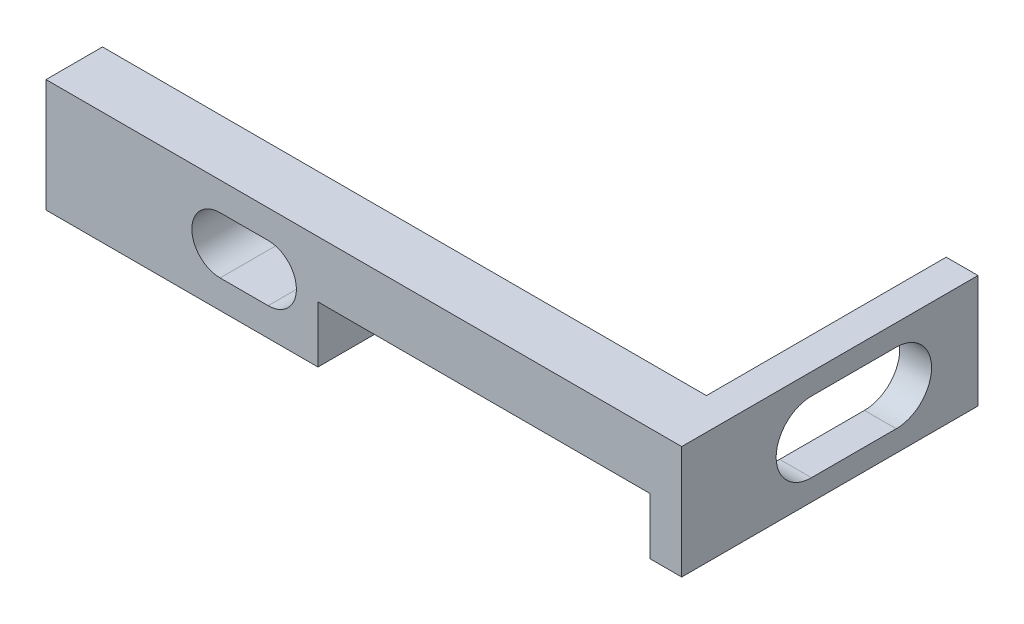
ISO-10303-21;
HEADER;
FILE_DESCRIPTION(('STEP AP214'),'2;1');
FILE_NAME('part.step','',(''),(''),'','','');
FILE_SCHEMA(('AUTOMOTIVE_DESIGN { 1 0 10303 214 1 1 1 1 }'));
ENDSEC;
DATA;
#1=APPLICATION_CONTEXT('core data for automotive mechanical design processes');
#2=APPLICATION_PROTOCOL_DEFINITION('international standard','automotive_design',2000,#1);
#3=PRODUCT_CONTEXT('',#1,'mechanical');
#4=PRODUCT('Part','Part','',(#3));
#5=PRODUCT_RELATED_PRODUCT_CATEGORY('part','',(#4));
#6=PRODUCT_DEFINITION_FORMATION('','',#4);
#7=PRODUCT_DEFINITION_CONTEXT('part definition',#1,'design');
#8=PRODUCT_DEFINITION('design','',#6,#7);
#9=PRODUCT_DEFINITION_SHAPE('','',#8);
#10=(LENGTH_UNIT() NAMED_UNIT(*) SI_UNIT(.MILLI.,.METRE.));
#11=(NAMED_UNIT(*) PLANE_ANGLE_UNIT() SI_UNIT($,.RADIAN.));
#12=(NAMED_UNIT(*) SI_UNIT($,.STERADIAN.) SOLID_ANGLE_UNIT());
#13=UNCERTAINTY_MEASURE_WITH_UNIT(LENGTH_MEASURE(1.E-05),#10,'distance_accuracy_value','');
#14=(GEOMETRIC_REPRESENTATION_CONTEXT(3) GLOBAL_UNCERTAINTY_ASSIGNED_CONTEXT((#13)) GLOBAL_UNIT_ASSIGNED_CONTEXT((#10,
#11,#12)) REPRESENTATION_CONTEXT('',''));
#15=CARTESIAN_POINT('',(0.,0.,0.));
#16=DIRECTION('',(0.,0.,1.));
#17=DIRECTION('',(1.,0.,0.));
#18=AXIS2_PLACEMENT_3D('',#15,#16,#17);
#19=CARTESIAN_POINT('',(45.,0.,0.));
#20=DIRECTION('',(0.,1.,0.));
#21=DIRECTION('',(0.,0.,1.));
#22=AXIS2_PLACEMENT_3D('',#19,#20,#21);
#23=PLANE('',#22);
#24=DIRECTION('',(0.,0.,-1.));
#25=VECTOR('',#24,1.);
#26=CARTESIAN_POINT('',(41.75,0.,12.5));
#27=LINE('',#26,#25);
#28=CARTESIAN_POINT('',(41.75,0.,12.5));
#29=VERTEX_POINT('',#28);
#30=CARTESIAN_POINT('',(41.75,0.,8.5));
#31=VERTEX_POINT('',#30);
#32=EDGE_CURVE('E201',#29,#31,#27,.T.);
#33=ORIENTED_EDGE('',*,*,#32,.T.);
#34=DIRECTION('',(-1.,0.,0.));
#35=VECTOR('',#34,1.);
#36=CARTESIAN_POINT('',(65.25,0.,8.5));
#37=LINE('',#36,#35);
#38=CARTESIAN_POINT('',(65.25,0.,8.5));
#39=VERTEX_POINT('',#38);
#40=EDGE_CURVE('E240',#39,#31,#37,.T.);
#41=ORIENTED_EDGE('',*,*,#40,.F.);
#42=DIRECTION('',(0.,0.,-1.));
#43=VECTOR('',#42,1.);
#44=CARTESIAN_POINT('',(65.25,0.,0.));
#45=LINE('',#44,#43);
#46=CARTESIAN_POINT('',(65.25,0.,12.5));
#47=VERTEX_POINT('',#46);
#48=EDGE_CURVE('E225',#47,#39,#45,.T.);
#49=ORIENTED_EDGE('',*,*,#48,.F.);
#50=DIRECTION('',(-1.,0.,0.));
#51=VECTOR('',#50,1.);
#52=CARTESIAN_POINT('',(67.5,0.,12.5));
#53=LINE('',#52,#51);
#54=EDGE_CURVE('E249',#47,#29,#53,.T.);
#55=ORIENTED_EDGE('',*,*,#54,.T.);
#56=EDGE_LOOP('',(#33,#41,#49,#55));
#57=FACE_BOUND('',#56,.T.);
#58=ADVANCED_FACE('F32',(#57),#23,.F.);
#59=CARTESIAN_POINT('',(22.5,4.,-12.5));
#60=DIRECTION('',(1.,0.,0.));
#61=DIRECTION('',(0.,0.,1.));
#62=AXIS2_PLACEMENT_3D('',#59,#60,#61);
#63=PLANE('',#62);
#64=DIRECTION('',(0.,0.,-1.));
#65=VECTOR('',#64,1.);
#66=CARTESIAN_POINT('',(22.5,-4.,-8.47465440443784));
#67=LINE('',#66,#65);
#68=CARTESIAN_POINT('',(22.5,-4.,12.5));
#69=VERTEX_POINT('',#68);
#70=CARTESIAN_POINT('',(22.5,-4.,8.49999999999999));
#71=VERTEX_POINT('',#70);
#72=EDGE_CURVE('E230',#69,#71,#67,.T.);
#73=ORIENTED_EDGE('',*,*,#72,.F.);
#74=DIRECTION('',(0.,-1.,0.));
#75=VECTOR('',#74,1.);
#76=CARTESIAN_POINT('',(22.5,4.,12.5));
#77=LINE('',#76,#75);
#78=CARTESIAN_POINT('',(22.5,4.,12.5));
#79=VERTEX_POINT('',#78);
#80=EDGE_CURVE('E258',#79,#69,#77,.T.);
#81=ORIENTED_EDGE('',*,*,#80,.F.);
#82=DIRECTION('',(0.,0.,-1.));
#83=VECTOR('',#82,1.);
#84=CARTESIAN_POINT('',(22.5,4.,-12.5));
#85=LINE('',#84,#83);
#86=CARTESIAN_POINT('',(22.5,4.,8.5));
#87=VERTEX_POINT('',#86);
#88=EDGE_CURVE('E250',#79,#87,#85,.T.);
#89=ORIENTED_EDGE('',*,*,#88,.T.);
#90=DIRECTION('',(0.,1.,0.));
#91=VECTOR('',#90,1.);
#92=CARTESIAN_POINT('',(22.5,-4.,8.5));
#93=LINE('',#92,#91);
#94=EDGE_CURVE('E193',#71,#87,#93,.T.);
#95=ORIENTED_EDGE('',*,*,#94,.F.);
#96=EDGE_LOOP('',(#73,#81,#89,#95));
#97=FACE_BOUND('',#96,.T.);
#98=ADVANCED_FACE('F34',(#97),#63,.F.);
#99=CARTESIAN_POINT('',(67.5,4.,-12.5));
#100=DIRECTION('',(-1.,0.,0.));
#101=DIRECTION('',(0.,0.,-1.));
#102=AXIS2_PLACEMENT_3D('',#99,#100,#101);
#103=PLANE('',#102);
#104=DIRECTION('',(0.,0.,-1.));
#105=VECTOR('',#104,1.);
#106=CARTESIAN_POINT('',(67.5,2.5,3.31454912255757));
#107=LINE('',#106,#105);
#108=CARTESIAN_POINT('',(67.5,2.5,3.31454912255757));
#109=VERTEX_POINT('',#108);
#110=CARTESIAN_POINT('',(67.5,2.5,-2.68545087744243));
#111=VERTEX_POINT('',#110);
#112=EDGE_CURVE('E181',#109,#111,#107,.T.);
#113=ORIENTED_EDGE('',*,*,#112,.T.);
#114=CARTESIAN_POINT('',(67.5,0.,-2.68545087744243));
#115=DIRECTION('',(-1.,0.,0.));
#116=DIRECTION('',(0.,0.,1.));
#117=AXIS2_PLACEMENT_3D('',#114,#115,#116);
#118=CIRCLE('',#117,2.5);
#119=CARTESIAN_POINT('',(67.5,-2.5,-2.68545087744243));
#120=VERTEX_POINT('',#119);
#121=EDGE_CURVE('E184',#111,#120,#118,.T.);
#122=ORIENTED_EDGE('',*,*,#121,.T.);
#123=DIRECTION('',(0.,0.,1.));
#124=VECTOR('',#123,1.);
#125=CARTESIAN_POINT('',(67.5,-2.5,3.31454912255757));
#126=LINE('',#125,#124);
#127=CARTESIAN_POINT('',(67.5,-2.5,3.31454912255757));
#128=VERTEX_POINT('',#127);
#129=EDGE_CURVE('E187',#120,#128,#126,.T.);
#130=ORIENTED_EDGE('',*,*,#129,.T.);
#131=CARTESIAN_POINT('',(67.5,0.,3.31454912255757));
#132=DIRECTION('',(-1.,0.,0.));
#133=DIRECTION('',(0.,0.,1.));
#134=AXIS2_PLACEMENT_3D('',#131,#132,#133);
#135=CIRCLE('',#134,2.5);
#136=EDGE_CURVE('E176',#128,#109,#135,.T.);
#137=ORIENTED_EDGE('',*,*,#136,.T.);
#138=EDGE_LOOP('',(#113,#122,#130,#137));
#139=FACE_BOUND('',#138,.T.);
#140=DIRECTION('',(0.,0.,1.));
#141=VECTOR('',#140,1.);
#142=CARTESIAN_POINT('',(67.5,4.,-12.5));
#143=LINE('',#142,#141);
#144=CARTESIAN_POINT('',(67.5,4.,-8.47465440443784));
#145=VERTEX_POINT('',#144);
#146=CARTESIAN_POINT('',(67.5,4.,12.5));
#147=VERTEX_POINT('',#146);
#148=EDGE_CURVE('E253',#145,#147,#143,.T.);
#149=ORIENTED_EDGE('',*,*,#148,.T.);
#150=DIRECTION('',(0.,-1.,0.));
#151=VECTOR('',#150,1.);
#152=CARTESIAN_POINT('',(67.5,4.,12.5));
#153=LINE('',#152,#151);
#154=CARTESIAN_POINT('',(67.5,-4.,12.5));
#155=VERTEX_POINT('',#154);
#156=EDGE_CURVE('E263',#147,#155,#153,.T.);
#157=ORIENTED_EDGE('',*,*,#156,.T.);
#158=DIRECTION('',(0.,0.,1.));
#159=VECTOR('',#158,1.);
#160=CARTESIAN_POINT('',(67.5,-4.,12.5));
#161=LINE('',#160,#159);
#162=CARTESIAN_POINT('',(67.5,-4.,-8.47465440443784));
#163=VERTEX_POINT('',#162);
#164=EDGE_CURVE('E212',#163,#155,#161,.T.);
#165=ORIENTED_EDGE('',*,*,#164,.F.);
#166=DIRECTION('',(0.,1.,0.));
#167=VECTOR('',#166,1.);
#168=CARTESIAN_POINT('',(67.5,0.,-8.47465440443784));
#169=LINE('',#168,#167);
#170=EDGE_CURVE('E236',#163,#145,#169,.T.);
#171=ORIENTED_EDGE('',*,*,#170,.T.);
#172=EDGE_LOOP('',(#149,#157,#165,#171));
#173=FACE_BOUND('',#172,.T.);
#174=ADVANCED_FACE('F310',(#139,#173),#103,.F.);
#175=CARTESIAN_POINT('',(67.5,4.,12.5));
#176=DIRECTION('',(0.,0.,-1.));
#177=DIRECTION('',(1.,0.,0.));
#178=AXIS2_PLACEMENT_3D('',#175,#176,#177);
#179=PLANE('',#178);
#180=DIRECTION('',(-1.,0.,0.));
#181=VECTOR('',#180,1.);
#182=CARTESIAN_POINT('',(38.2252375293289,-2.00000000000001,12.5));
#183=LINE('',#182,#181);
#184=CARTESIAN_POINT('',(38.2252375293289,-2.,12.5));
#185=VERTEX_POINT('',#184);
#186=CARTESIAN_POINT('',(34.8252375293289,-2.00000000000001,12.5));
#187=VERTEX_POINT('',#186);
#188=EDGE_CURVE('E153',#185,#187,#183,.T.);
#189=ORIENTED_EDGE('',*,*,#188,.T.);
#190=CARTESIAN_POINT('',(34.8252375293289,0.,12.5));
#191=DIRECTION('',(0.,0.,-1.));
#192=DIRECTION('',(-1.,0.,0.));
#193=AXIS2_PLACEMENT_3D('',#190,#191,#192);
#194=CIRCLE('',#193,2.);
#195=CARTESIAN_POINT('',(34.8252375293289,1.99999999999999,12.5));
#196=VERTEX_POINT('',#195);
#197=EDGE_CURVE('E160',#187,#196,#194,.T.);
#198=ORIENTED_EDGE('',*,*,#197,.T.);
#199=DIRECTION('',(1.,0.,0.));
#200=VECTOR('',#199,1.);
#201=CARTESIAN_POINT('',(38.2252375293289,1.99999999999999,12.5));
#202=LINE('',#201,#200);
#203=CARTESIAN_POINT('',(38.2252375293289,1.99999999999999,12.5));
#204=VERTEX_POINT('',#203);
#205=EDGE_CURVE('E165',#196,#204,#202,.T.);
#206=ORIENTED_EDGE('',*,*,#205,.T.);
#207=CARTESIAN_POINT('',(38.2252375293289,0.,12.5));
#208=DIRECTION('',(0.,0.,-1.));
#209=DIRECTION('',(-1.,0.,0.));
#210=AXIS2_PLACEMENT_3D('',#207,#208,#209);
#211=CIRCLE('',#210,2.);
#212=EDGE_CURVE('E169',#204,#185,#211,.T.);
#213=ORIENTED_EDGE('',*,*,#212,.T.);
#214=EDGE_LOOP('',(#189,#198,#206,#213));
#215=FACE_BOUND('',#214,.T.);
#216=ORIENTED_EDGE('',*,*,#54,.F.);
#217=DIRECTION('',(0.,1.,0.));
#218=VECTOR('',#217,1.);
#219=CARTESIAN_POINT('',(65.25,-4.,12.5));
#220=LINE('',#219,#218);
#221=CARTESIAN_POINT('',(65.25,-4.,12.5));
#222=VERTEX_POINT('',#221);
#223=EDGE_CURVE('E223',#222,#47,#220,.T.);
#224=ORIENTED_EDGE('',*,*,#223,.F.);
#225=DIRECTION('',(-1.,0.,0.));
#226=VECTOR('',#225,1.);
#227=CARTESIAN_POINT('',(67.5,-4.,12.5));
#228=LINE('',#227,#226);
#229=EDGE_CURVE('E215',#155,#222,#228,.T.);
#230=ORIENTED_EDGE('',*,*,#229,.F.);
#231=ORIENTED_EDGE('',*,*,#156,.F.);
#232=DIRECTION('',(-1.,0.,0.));
#233=VECTOR('',#232,1.);
#234=CARTESIAN_POINT('',(67.5,4.,12.5));
#235=LINE('',#234,#233);
#236=EDGE_CURVE('E256',#147,#79,#235,.T.);
#237=ORIENTED_EDGE('',*,*,#236,.T.);
#238=ORIENTED_EDGE('',*,*,#80,.T.);
#239=DIRECTION('',(-1.,0.,0.));
#240=VECTOR('',#239,1.);
#241=CARTESIAN_POINT('',(24.75,-4.,12.5));
#242=LINE('',#241,#240);
#243=CARTESIAN_POINT('',(41.75,-4.,12.5));
#244=VERTEX_POINT('',#243);
#245=EDGE_CURVE('E228',#244,#69,#242,.T.);
#246=ORIENTED_EDGE('',*,*,#245,.F.);
#247=DIRECTION('',(0.,1.,0.));
#248=VECTOR('',#247,1.);
#249=CARTESIAN_POINT('',(41.75,-4.,12.5));
#250=LINE('',#249,#248);
#251=EDGE_CURVE('E210',#244,#29,#250,.T.);
#252=ORIENTED_EDGE('',*,*,#251,.T.);
#253=EDGE_LOOP('',(#216,#224,#230,#231,#237,#238,#246,#252));
#254=FACE_BOUND('',#253,.T.);
#255=ADVANCED_FACE('F167',(#215,#254),#179,.F.);
#256=CARTESIAN_POINT('',(45.,4.,0.));
#257=DIRECTION('',(0.,1.,0.));
#258=DIRECTION('',(0.,0.,1.));
#259=AXIS2_PLACEMENT_3D('',#256,#257,#258);
#260=PLANE('',#259);
#261=ORIENTED_EDGE('',*,*,#88,.F.);
#262=ORIENTED_EDGE('',*,*,#236,.F.);
#263=ORIENTED_EDGE('',*,*,#148,.F.);
#264=DIRECTION('',(-1.,0.,0.));
#265=VECTOR('',#264,1.);
#266=CARTESIAN_POINT('',(67.5,4.,-8.47465440443784));
#267=LINE('',#266,#265);
#268=CARTESIAN_POINT('',(65.25,4.,-8.47465440443784));
#269=VERTEX_POINT('',#268);
#270=EDGE_CURVE('E233',#145,#269,#267,.T.);
#271=ORIENTED_EDGE('',*,*,#270,.T.);
#272=DIRECTION('',(0.,0.,1.));
#273=VECTOR('',#272,1.);
#274=CARTESIAN_POINT('',(65.25,4.,-8.5));
#275=LINE('',#274,#273);
#276=CARTESIAN_POINT('',(65.25,4.,8.5));
#277=VERTEX_POINT('',#276);
#278=EDGE_CURVE('E239',#269,#277,#275,.T.);
#279=ORIENTED_EDGE('',*,*,#278,.T.);
#280=DIRECTION('',(-1.,0.,0.));
#281=VECTOR('',#280,1.);
#282=CARTESIAN_POINT('',(65.25,4.,8.5));
#283=LINE('',#282,#281);
#284=EDGE_CURVE('E244',#277,#87,#283,.T.);
#285=ORIENTED_EDGE('',*,*,#284,.T.);
#286=EDGE_LOOP('',(#261,#262,#263,#271,#279,#285));
#287=FACE_BOUND('',#286,.T.);
#288=ADVANCED_FACE('F314',(#287),#260,.T.);
#289=CARTESIAN_POINT('',(65.25,0.,8.5));
#290=DIRECTION('',(0.,0.,1.));
#291=DIRECTION('',(-1.,0.,0.));
#292=AXIS2_PLACEMENT_3D('',#289,#290,#291);
#293=PLANE('',#292);
#294=DIRECTION('',(1.,0.,0.));
#295=VECTOR('',#294,1.);
#296=CARTESIAN_POINT('',(65.25,1.99999999999999,8.5));
#297=LINE('',#296,#295);
#298=CARTESIAN_POINT('',(34.8252375293289,1.99999999999999,8.49999999999999));
#299=VERTEX_POINT('',#298);
#300=CARTESIAN_POINT('',(38.2252375293289,1.99999999999999,8.49999999999999));
#301=VERTEX_POINT('',#300);
#302=EDGE_CURVE('E40',#299,#301,#297,.T.);
#303=ORIENTED_EDGE('',*,*,#302,.F.);
#304=CARTESIAN_POINT('',(34.8252375293289,0.,8.5));
#305=DIRECTION('',(0.,0.,-1.));
#306=DIRECTION('',(-1.,0.,0.));
#307=AXIS2_PLACEMENT_3D('',#304,#305,#306);
#308=CIRCLE('',#307,2.);
#309=CARTESIAN_POINT('',(34.8252375293289,-2.00000000000001,8.5));
#310=VERTEX_POINT('',#309);
#311=EDGE_CURVE('E281',#310,#299,#308,.T.);
#312=ORIENTED_EDGE('',*,*,#311,.F.);
#313=DIRECTION('',(-1.,0.,0.));
#314=VECTOR('',#313,1.);
#315=CARTESIAN_POINT('',(65.25,-2.00000000000001,8.5));
#316=LINE('',#315,#314);
#317=CARTESIAN_POINT('',(38.2252375293289,-2.00000000000001,8.49999999999999));
#318=VERTEX_POINT('',#317);
#319=EDGE_CURVE('E155',#318,#310,#316,.T.);
#320=ORIENTED_EDGE('',*,*,#319,.F.);
#321=CARTESIAN_POINT('',(38.2252375293289,0.,8.5));
#322=DIRECTION('',(0.,0.,-1.));
#323=DIRECTION('',(-1.,0.,0.));
#324=AXIS2_PLACEMENT_3D('',#321,#322,#323);
#325=CIRCLE('',#324,2.);
#326=EDGE_CURVE('E11',#301,#318,#325,.T.);
#327=ORIENTED_EDGE('',*,*,#326,.F.);
#328=EDGE_LOOP('',(#303,#312,#320,#327));
#329=FACE_BOUND('',#328,.T.);
#330=ORIENTED_EDGE('',*,*,#284,.F.);
#331=DIRECTION('',(0.,1.,0.));
#332=VECTOR('',#331,1.);
#333=CARTESIAN_POINT('',(65.25,0.,8.5));
#334=LINE('',#333,#332);
#335=EDGE_CURVE('E243',#39,#277,#334,.T.);
#336=ORIENTED_EDGE('',*,*,#335,.F.);
#337=ORIENTED_EDGE('',*,*,#40,.T.);
#338=DIRECTION('',(0.,1.,0.));
#339=VECTOR('',#338,1.);
#340=CARTESIAN_POINT('',(41.75,-4.,8.5));
#341=LINE('',#340,#339);
#342=CARTESIAN_POINT('',(41.75,-4.,8.5));
#343=VERTEX_POINT('',#342);
#344=EDGE_CURVE('E206',#343,#31,#341,.T.);
#345=ORIENTED_EDGE('',*,*,#344,.F.);
#346=DIRECTION('',(-1.,0.,0.));
#347=VECTOR('',#346,1.);
#348=CARTESIAN_POINT('',(24.75,-4.,8.5));
#349=LINE('',#348,#347);
#350=EDGE_CURVE('E204',#343,#71,#349,.T.);
#351=ORIENTED_EDGE('',*,*,#350,.T.);
#352=ORIENTED_EDGE('',*,*,#94,.T.);
#353=EDGE_LOOP('',(#330,#336,#337,#345,#351,#352));
#354=FACE_BOUND('',#353,.T.);
#355=ADVANCED_FACE('F288',(#329,#354),#293,.F.);
#356=CARTESIAN_POINT('',(65.25,0.,-8.5));
#357=DIRECTION('',(1.,0.,0.));
#358=DIRECTION('',(0.,0.,1.));
#359=AXIS2_PLACEMENT_3D('',#356,#357,#358);
#360=PLANE('',#359);
#361=DIRECTION('',(0.,0.,1.));
#362=VECTOR('',#361,1.);
#363=CARTESIAN_POINT('',(65.25,-2.5,-8.5));
#364=LINE('',#363,#362);
#365=CARTESIAN_POINT('',(65.25,-2.5,-2.68545087744243));
#366=VERTEX_POINT('',#365);
#367=CARTESIAN_POINT('',(65.25,-2.5,3.31454912255757));
#368=VERTEX_POINT('',#367);
#369=EDGE_CURVE('E274',#366,#368,#364,.T.);
#370=ORIENTED_EDGE('',*,*,#369,.F.);
#371=CARTESIAN_POINT('',(65.25,0.,-2.68545087744243));
#372=DIRECTION('',(-1.,0.,0.));
#373=DIRECTION('',(0.,0.,1.));
#374=AXIS2_PLACEMENT_3D('',#371,#372,#373);
#375=CIRCLE('',#374,2.5);
#376=CARTESIAN_POINT('',(65.25,2.5,-2.68545087744243));
#377=VERTEX_POINT('',#376);
#378=EDGE_CURVE('E271',#377,#366,#375,.T.);
#379=ORIENTED_EDGE('',*,*,#378,.F.);
#380=DIRECTION('',(0.,0.,-1.));
#381=VECTOR('',#380,1.);
#382=CARTESIAN_POINT('',(65.25,2.5,-8.5));
#383=LINE('',#382,#381);
#384=CARTESIAN_POINT('',(65.25,2.5,3.31454912255757));
#385=VERTEX_POINT('',#384);
#386=EDGE_CURVE('E268',#385,#377,#383,.T.);
#387=ORIENTED_EDGE('',*,*,#386,.F.);
#388=CARTESIAN_POINT('',(65.25,0.,3.31454912255757));
#389=DIRECTION('',(-1.,0.,0.));
#390=DIRECTION('',(0.,0.,1.));
#391=AXIS2_PLACEMENT_3D('',#388,#389,#390);
#392=CIRCLE('',#391,2.5);
#393=EDGE_CURVE('E277',#368,#385,#392,.T.);
#394=ORIENTED_EDGE('',*,*,#393,.F.);
#395=EDGE_LOOP('',(#370,#379,#387,#394));
#396=FACE_BOUND('',#395,.T.);
#397=ORIENTED_EDGE('',*,*,#335,.T.);
#398=ORIENTED_EDGE('',*,*,#278,.F.);
#399=DIRECTION('',(0.,1.,0.));
#400=VECTOR('',#399,1.);
#401=CARTESIAN_POINT('',(65.25,0.,-8.47465440443784));
#402=LINE('',#401,#400);
#403=CARTESIAN_POINT('',(65.25,-4.,-8.47465440443784));
#404=VERTEX_POINT('',#403);
#405=EDGE_CURVE('E266',#404,#269,#402,.T.);
#406=ORIENTED_EDGE('',*,*,#405,.F.);
#407=DIRECTION('',(0.,0.,-1.));
#408=VECTOR('',#407,1.);
#409=CARTESIAN_POINT('',(65.25,-4.,12.5));
#410=LINE('',#409,#408);
#411=EDGE_CURVE('E218',#222,#404,#410,.T.);
#412=ORIENTED_EDGE('',*,*,#411,.F.);
#413=ORIENTED_EDGE('',*,*,#223,.T.);
#414=ORIENTED_EDGE('',*,*,#48,.T.);
#415=EDGE_LOOP('',(#397,#398,#406,#412,#413,#414));
#416=FACE_BOUND('',#415,.T.);
#417=ADVANCED_FACE('F339',(#396,#416),#360,.F.);
#418=CARTESIAN_POINT('',(67.5,0.,-8.47465440443784));
#419=DIRECTION('',(0.,0.,1.));
#420=DIRECTION('',(-1.,0.,0.));
#421=AXIS2_PLACEMENT_3D('',#418,#419,#420);
#422=PLANE('',#421);
#423=ORIENTED_EDGE('',*,*,#405,.T.);
#424=ORIENTED_EDGE('',*,*,#270,.F.);
#425=ORIENTED_EDGE('',*,*,#170,.F.);
#426=DIRECTION('',(1.,0.,0.));
#427=VECTOR('',#426,1.);
#428=CARTESIAN_POINT('',(67.5,-4.,-8.47465440443784));
#429=LINE('',#428,#427);
#430=EDGE_CURVE('E221',#404,#163,#429,.T.);
#431=ORIENTED_EDGE('',*,*,#430,.F.);
#432=EDGE_LOOP('',(#423,#424,#425,#431));
#433=FACE_BOUND('',#432,.T.);
#434=ADVANCED_FACE('F336',(#433),#422,.F.);
#435=CARTESIAN_POINT('',(45.,-4.,0.));
#436=DIRECTION('',(0.,1.,0.));
#437=DIRECTION('',(0.,0.,1.));
#438=AXIS2_PLACEMENT_3D('',#435,#436,#437);
#439=PLANE('',#438);
#440=ORIENTED_EDGE('',*,*,#350,.F.);
#441=DIRECTION('',(0.,0.,-1.));
#442=VECTOR('',#441,1.);
#443=CARTESIAN_POINT('',(41.75,-4.,12.5));
#444=LINE('',#443,#442);
#445=EDGE_CURVE('E202',#244,#343,#444,.T.);
#446=ORIENTED_EDGE('',*,*,#445,.F.);
#447=ORIENTED_EDGE('',*,*,#245,.T.);
#448=ORIENTED_EDGE('',*,*,#72,.T.);
#449=EDGE_LOOP('',(#440,#446,#447,#448));
#450=FACE_BOUND('',#449,.T.);
#451=ADVANCED_FACE('F348',(#450),#439,.F.);
#452=CARTESIAN_POINT('',(45.,-4.,0.));
#453=DIRECTION('',(0.,-1.,0.));
#454=DIRECTION('',(0.,0.,-1.));
#455=AXIS2_PLACEMENT_3D('',#452,#453,#454);
#456=PLANE('',#455);
#457=ORIENTED_EDGE('',*,*,#164,.T.);
#458=ORIENTED_EDGE('',*,*,#229,.T.);
#459=ORIENTED_EDGE('',*,*,#411,.T.);
#460=ORIENTED_EDGE('',*,*,#430,.T.);
#461=EDGE_LOOP('',(#457,#458,#459,#460));
#462=FACE_BOUND('',#461,.T.);
#463=ADVANCED_FACE('F333',(#462),#456,.T.);
#464=CARTESIAN_POINT('',(41.75,-4.,12.5));
#465=DIRECTION('',(-1.,0.,0.));
#466=DIRECTION('',(0.,0.,-1.));
#467=AXIS2_PLACEMENT_3D('',#464,#465,#466);
#468=PLANE('',#467);
#469=ORIENTED_EDGE('',*,*,#32,.F.);
#470=ORIENTED_EDGE('',*,*,#251,.F.);
#471=ORIENTED_EDGE('',*,*,#445,.T.);
#472=ORIENTED_EDGE('',*,*,#344,.T.);
#473=EDGE_LOOP('',(#469,#470,#471,#472));
#474=FACE_BOUND('',#473,.T.);
#475=ADVANCED_FACE('F351',(#474),#468,.F.);
#476=CARTESIAN_POINT('',(22.5,0.,3.31454912255757));
#477=DIRECTION('',(1.,0.,0.));
#478=DIRECTION('',(0.,0.,1.));
#479=AXIS2_PLACEMENT_3D('',#476,#477,#478);
#480=CYLINDRICAL_SURFACE('',#479,2.5);
#481=DIRECTION('',(1.,0.,0.));
#482=VECTOR('',#481,1.);
#483=CARTESIAN_POINT('',(22.5,-2.5,3.31454912255757));
#484=LINE('',#483,#482);
#485=EDGE_CURVE('E191',#368,#128,#484,.T.);
#486=ORIENTED_EDGE('',*,*,#485,.F.);
#487=ORIENTED_EDGE('',*,*,#393,.T.);
#488=DIRECTION('',(1.,0.,0.));
#489=VECTOR('',#488,1.);
#490=CARTESIAN_POINT('',(22.5,2.5,3.31454912255757));
#491=LINE('',#490,#489);
#492=EDGE_CURVE('E190',#385,#109,#491,.T.);
#493=ORIENTED_EDGE('',*,*,#492,.T.);
#494=ORIENTED_EDGE('',*,*,#136,.F.);
#495=EDGE_LOOP('',(#486,#487,#493,#494));
#496=FACE_BOUND('',#495,.T.);
#497=ADVANCED_FACE('F355',(#496),#480,.F.);
#498=CARTESIAN_POINT('',(22.5,-2.5,3.31454912255757));
#499=DIRECTION('',(0.,-1.,0.));
#500=DIRECTION('',(0.,0.,-1.));
#501=AXIS2_PLACEMENT_3D('',#498,#499,#500);
#502=PLANE('',#501);
#503=DIRECTION('',(1.,0.,0.));
#504=VECTOR('',#503,1.);
#505=CARTESIAN_POINT('',(22.5,-2.5,-2.68545087744243));
#506=LINE('',#505,#504);
#507=EDGE_CURVE('E194',#366,#120,#506,.T.);
#508=ORIENTED_EDGE('',*,*,#507,.F.);
#509=ORIENTED_EDGE('',*,*,#369,.T.);
#510=ORIENTED_EDGE('',*,*,#485,.T.);
#511=ORIENTED_EDGE('',*,*,#129,.F.);
#512=EDGE_LOOP('',(#508,#509,#510,#511));
#513=FACE_BOUND('',#512,.T.);
#514=ADVANCED_FACE('F361',(#513),#502,.F.);
#515=CARTESIAN_POINT('',(22.5,0.,-2.68545087744243));
#516=DIRECTION('',(1.,0.,0.));
#517=DIRECTION('',(0.,0.,1.));
#518=AXIS2_PLACEMENT_3D('',#515,#516,#517);
#519=CYLINDRICAL_SURFACE('',#518,2.5);
#520=DIRECTION('',(1.,0.,0.));
#521=VECTOR('',#520,1.);
#522=CARTESIAN_POINT('',(22.5,2.5,-2.68545087744243));
#523=LINE('',#522,#521);
#524=EDGE_CURVE('E196',#377,#111,#523,.T.);
#525=ORIENTED_EDGE('',*,*,#524,.F.);
#526=ORIENTED_EDGE('',*,*,#378,.T.);
#527=ORIENTED_EDGE('',*,*,#507,.T.);
#528=ORIENTED_EDGE('',*,*,#121,.F.);
#529=EDGE_LOOP('',(#525,#526,#527,#528));
#530=FACE_BOUND('',#529,.T.);
#531=ADVANCED_FACE('F299',(#530),#519,.F.);
#532=CARTESIAN_POINT('',(22.5,2.5,3.31454912255757));
#533=DIRECTION('',(0.,1.,0.));
#534=DIRECTION('',(0.,0.,1.));
#535=AXIS2_PLACEMENT_3D('',#532,#533,#534);
#536=PLANE('',#535);
#537=ORIENTED_EDGE('',*,*,#492,.F.);
#538=ORIENTED_EDGE('',*,*,#386,.T.);
#539=ORIENTED_EDGE('',*,*,#524,.T.);
#540=ORIENTED_EDGE('',*,*,#112,.F.);
#541=EDGE_LOOP('',(#537,#538,#539,#540));
#542=FACE_BOUND('',#541,.T.);
#543=ADVANCED_FACE('F292',(#542),#536,.F.);
#544=CARTESIAN_POINT('',(38.2252375293289,0.,-8.47465440443784));
#545=DIRECTION('',(0.,0.,1.));
#546=DIRECTION('',(-1.,0.,0.));
#547=AXIS2_PLACEMENT_3D('',#544,#545,#546);
#548=CYLINDRICAL_SURFACE('',#547,2.);
#549=DIRECTION('',(0.,0.,1.));
#550=VECTOR('',#549,1.);
#551=CARTESIAN_POINT('',(38.2252375293289,1.99999999999999,-8.47465440443784));
#552=LINE('',#551,#550);
#553=EDGE_CURVE('E174',#301,#204,#552,.T.);
#554=ORIENTED_EDGE('',*,*,#553,.F.);
#555=ORIENTED_EDGE('',*,*,#326,.T.);
#556=DIRECTION('',(0.,0.,1.));
#557=VECTOR('',#556,1.);
#558=CARTESIAN_POINT('',(38.2252375293289,-2.00000000000001,-8.47465440443784));
#559=LINE('',#558,#557);
#560=EDGE_CURVE('E46',#318,#185,#559,.T.);
#561=ORIENTED_EDGE('',*,*,#560,.T.);
#562=ORIENTED_EDGE('',*,*,#212,.F.);
#563=EDGE_LOOP('',(#554,#555,#561,#562));
#564=FACE_BOUND('',#563,.T.);
#565=ADVANCED_FACE('F290',(#564),#548,.F.);
#566=CARTESIAN_POINT('',(38.2252375293289,1.99999999999999,-8.47465440443784));
#567=DIRECTION('',(0.,1.,0.));
#568=DIRECTION('',(1.,0.,0.));
#569=AXIS2_PLACEMENT_3D('',#566,#567,#568);
#570=PLANE('',#569);
#571=DIRECTION('',(0.,0.,1.));
#572=VECTOR('',#571,1.);
#573=CARTESIAN_POINT('',(34.8252375293289,1.99999999999999,-8.47465440443784));
#574=LINE('',#573,#572);
#575=EDGE_CURVE('E157',#299,#196,#574,.T.);
#576=ORIENTED_EDGE('',*,*,#575,.F.);
#577=ORIENTED_EDGE('',*,*,#302,.T.);
#578=ORIENTED_EDGE('',*,*,#553,.T.);
#579=ORIENTED_EDGE('',*,*,#205,.F.);
#580=EDGE_LOOP('',(#576,#577,#578,#579));
#581=FACE_BOUND('',#580,.T.);
#582=ADVANCED_FACE('F285',(#581),#570,.F.);
#583=CARTESIAN_POINT('',(34.8252375293289,0.,-8.47465440443784));
#584=DIRECTION('',(0.,0.,1.));
#585=DIRECTION('',(-1.,0.,0.));
#586=AXIS2_PLACEMENT_3D('',#583,#584,#585);
#587=CYLINDRICAL_SURFACE('',#586,2.);
#588=DIRECTION('',(0.,0.,1.));
#589=VECTOR('',#588,1.);
#590=CARTESIAN_POINT('',(34.8252375293289,-2.00000000000001,-8.47465440443784));
#591=LINE('',#590,#589);
#592=EDGE_CURVE('E54',#310,#187,#591,.T.);
#593=ORIENTED_EDGE('',*,*,#592,.F.);
#594=ORIENTED_EDGE('',*,*,#311,.T.);
#595=ORIENTED_EDGE('',*,*,#575,.T.);
#596=ORIENTED_EDGE('',*,*,#197,.F.);
#597=EDGE_LOOP('',(#593,#594,#595,#596));
#598=FACE_BOUND('',#597,.T.);
#599=ADVANCED_FACE('F161',(#598),#587,.F.);
#600=CARTESIAN_POINT('',(38.2252375293289,-2.00000000000001,-8.47465440443784));
#601=DIRECTION('',(0.,-1.,0.));
#602=DIRECTION('',(-1.,0.,0.));
#603=AXIS2_PLACEMENT_3D('',#600,#601,#602);
#604=PLANE('',#603);
#605=ORIENTED_EDGE('',*,*,#560,.F.);
#606=ORIENTED_EDGE('',*,*,#319,.T.);
#607=ORIENTED_EDGE('',*,*,#592,.T.);
#608=ORIENTED_EDGE('',*,*,#188,.F.);
#609=EDGE_LOOP('',(#605,#606,#607,#608));
#610=FACE_BOUND('',#609,.T.);
#611=ADVANCED_FACE('F151',(#610),#604,.F.);
#612=CLOSED_SHELL('',(#58,#98,#174,#255,#288,#355,#417,#434,#451,#463,#475,#497,#514,#531,#543,
#565,#582,#599,#611));
#613=MANIFOLD_SOLID_BREP('B2',#612);
#614=ADVANCED_BREP_SHAPE_REPRESENTATION('',(#18,#613),#14);
#615=SHAPE_DEFINITION_REPRESENTATION(#9,#614);
ENDSEC;
END-ISO-10303-21;
